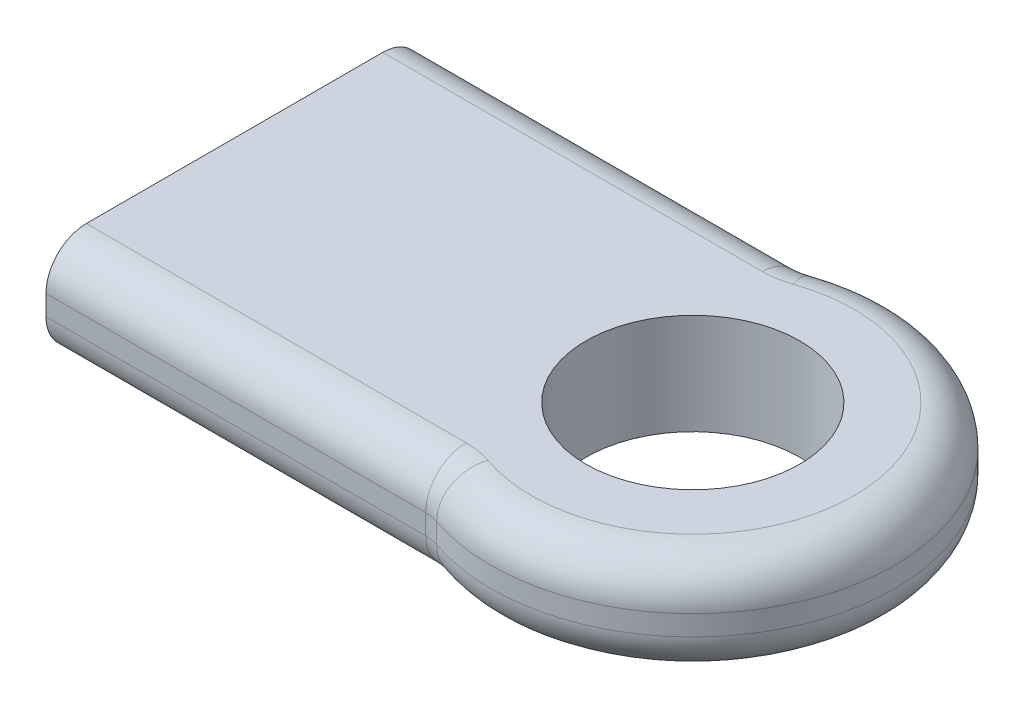
ISO-10303-21;
HEADER;
FILE_DESCRIPTION(('STEP AP214'),'2;1');
FILE_NAME('part.step','',(''),(''),'','','');
FILE_SCHEMA(('AUTOMOTIVE_DESIGN { 1 0 10303 214 1 1 1 1 }'));
ENDSEC;
DATA;
#1=APPLICATION_CONTEXT('core data for automotive mechanical design processes');
#2=APPLICATION_PROTOCOL_DEFINITION('international standard','automotive_design',2000,#1);
#3=PRODUCT_CONTEXT('',#1,'mechanical');
#4=PRODUCT('Part','Part','',(#3));
#5=PRODUCT_RELATED_PRODUCT_CATEGORY('part','',(#4));
#6=PRODUCT_DEFINITION_FORMATION('','',#4);
#7=PRODUCT_DEFINITION_CONTEXT('part definition',#1,'design');
#8=PRODUCT_DEFINITION('design','',#6,#7);
#9=PRODUCT_DEFINITION_SHAPE('','',#8);
#10=(LENGTH_UNIT() NAMED_UNIT(*) SI_UNIT(.MILLI.,.METRE.));
#11=(NAMED_UNIT(*) PLANE_ANGLE_UNIT() SI_UNIT($,.RADIAN.));
#12=(NAMED_UNIT(*) SI_UNIT($,.STERADIAN.) SOLID_ANGLE_UNIT());
#13=UNCERTAINTY_MEASURE_WITH_UNIT(LENGTH_MEASURE(1.E-05),#10,'distance_accuracy_value','');
#14=(GEOMETRIC_REPRESENTATION_CONTEXT(3) GLOBAL_UNCERTAINTY_ASSIGNED_CONTEXT((#13)) GLOBAL_UNIT_ASSIGNED_CONTEXT((#10,
#11,#12)) REPRESENTATION_CONTEXT('',''));
#15=CARTESIAN_POINT('',(0.,0.,0.));
#16=DIRECTION('',(0.,0.,1.));
#17=DIRECTION('',(1.,0.,0.));
#18=AXIS2_PLACEMENT_3D('',#15,#16,#17);
#19=CARTESIAN_POINT('',(0.,2.5,0.));
#20=DIRECTION('',(0.,1.,0.));
#21=DIRECTION('',(0.,0.,1.));
#22=AXIS2_PLACEMENT_3D('',#19,#20,#21);
#23=PLANE('',#22);
#24=DIRECTION('',(0.,0.,1.));
#25=VECTOR('',#24,1.);
#26=CARTESIAN_POINT('',(-22.72512135827,2.5,-9.35));
#27=LINE('',#26,#25);
#28=CARTESIAN_POINT('',(-22.72512135827,2.5,-7.35));
#29=VERTEX_POINT('',#28);
#30=CARTESIAN_POINT('',(-22.72512135827,2.5,7.35));
#31=VERTEX_POINT('',#30);
#32=EDGE_CURVE('E195',#29,#31,#27,.T.);
#33=ORIENTED_EDGE('',*,*,#32,.T.);
#34=DIRECTION('',(1.,0.,0.));
#35=VECTOR('',#34,1.);
#36=CARTESIAN_POINT('',(-3.54647712526107,2.5,7.35));
#37=LINE('',#36,#35);
#38=CARTESIAN_POINT('',(-3.8958311051687,2.5,7.35));
#39=VERTEX_POINT('',#38);
#40=EDGE_CURVE('E216',#31,#39,#37,.T.);
#41=ORIENTED_EDGE('',*,*,#40,.T.);
#42=CARTESIAN_POINT('',(-3.8958311051687,2.5,11.35));
#43=DIRECTION('',(0.,1.,0.));
#44=DIRECTION('',(0.,0.,1.));
#45=AXIS2_PLACEMENT_3D('',#42,#43,#44);
#46=CIRCLE('',#45,4.);
#47=CARTESIAN_POINT('',(-2.59722073677913,2.5,7.56666666666667));
#48=VERTEX_POINT('',#47);
#49=EDGE_CURVE('E213',#48,#39,#46,.T.);
#50=ORIENTED_EDGE('',*,*,#49,.F.);
#51=CARTESIAN_POINT('',(0.,2.5,0.));
#52=DIRECTION('',(0.,1.,0.));
#53=DIRECTION('',(0.,0.,1.));
#54=AXIS2_PLACEMENT_3D('',#51,#52,#53);
#55=CIRCLE('',#54,8.);
#56=CARTESIAN_POINT('',(-2.59722073677913,2.5,-7.56666666666667));
#57=VERTEX_POINT('',#56);
#58=EDGE_CURVE('E209',#48,#57,#55,.T.);
#59=ORIENTED_EDGE('',*,*,#58,.T.);
#60=CARTESIAN_POINT('',(-3.8958311051687,2.5,-11.35));
#61=DIRECTION('',(0.,1.,0.));
#62=DIRECTION('',(0.,0.,1.));
#63=AXIS2_PLACEMENT_3D('',#60,#61,#62);
#64=CIRCLE('',#63,4.);
#65=CARTESIAN_POINT('',(-3.8958311051687,2.5,-7.35));
#66=VERTEX_POINT('',#65);
#67=EDGE_CURVE('E206',#66,#57,#64,.T.);
#68=ORIENTED_EDGE('',*,*,#67,.F.);
#69=DIRECTION('',(-1.,0.,0.));
#70=VECTOR('',#69,1.);
#71=CARTESIAN_POINT('',(-22.72512135827,2.5,-7.35));
#72=LINE('',#71,#70);
#73=EDGE_CURVE('E211',#66,#29,#72,.T.);
#74=ORIENTED_EDGE('',*,*,#73,.T.);
#75=EDGE_LOOP('',(#33,#41,#50,#59,#68,#74));
#76=FACE_BOUND('',#75,.T.);
#77=CARTESIAN_POINT('',(0.,2.5,0.));
#78=DIRECTION('',(0.,1.,0.));
#79=DIRECTION('',(0.,0.,1.));
#80=AXIS2_PLACEMENT_3D('',#77,#78,#79);
#81=CIRCLE('',#80,5.3);
#82=CARTESIAN_POINT('',(0.,2.5,5.3));
#83=VERTEX_POINT('',#82);
#84=EDGE_CURVE('E189',#83,#83,#81,.T.);
#85=ORIENTED_EDGE('',*,*,#84,.F.);
#86=EDGE_LOOP('',(#85));
#87=FACE_BOUND('',#86,.T.);
#88=ADVANCED_FACE('F33',(#76,#87),#23,.T.);
#89=CARTESIAN_POINT('',(0.,-2.5,0.));
#90=DIRECTION('',(0.,1.,0.));
#91=DIRECTION('',(0.,0.,1.));
#92=AXIS2_PLACEMENT_3D('',#89,#90,#91);
#93=PLANE('',#92);
#94=CARTESIAN_POINT('',(-3.8958311051687,-2.5,11.35));
#95=DIRECTION('',(0.,1.,0.));
#96=DIRECTION('',(0.,0.,1.));
#97=AXIS2_PLACEMENT_3D('',#94,#95,#96);
#98=CIRCLE('',#97,4.);
#99=CARTESIAN_POINT('',(-3.8958311051687,-2.5,7.35));
#100=VERTEX_POINT('',#99);
#101=CARTESIAN_POINT('',(-2.59722073677913,-2.5,7.56666666666667));
#102=VERTEX_POINT('',#101);
#103=EDGE_CURVE('E233',#100,#102,#98,.F.);
#104=ORIENTED_EDGE('',*,*,#103,.F.);
#105=DIRECTION('',(1.,0.,0.));
#106=VECTOR('',#105,1.);
#107=CARTESIAN_POINT('',(0.,-2.5,7.35));
#108=LINE('',#107,#106);
#109=CARTESIAN_POINT('',(-22.72512135827,-2.5,7.35));
#110=VERTEX_POINT('',#109);
#111=EDGE_CURVE('E243',#100,#110,#108,.F.);
#112=ORIENTED_EDGE('',*,*,#111,.T.);
#113=DIRECTION('',(0.,0.,1.));
#114=VECTOR('',#113,1.);
#115=CARTESIAN_POINT('',(-22.72512135827,-2.5,-9.35));
#116=LINE('',#115,#114);
#117=CARTESIAN_POINT('',(-22.72512135827,-2.5,-7.35));
#118=VERTEX_POINT('',#117);
#119=EDGE_CURVE('E192',#118,#110,#116,.T.);
#120=ORIENTED_EDGE('',*,*,#119,.F.);
#121=DIRECTION('',(-1.,0.,0.));
#122=VECTOR('',#121,1.);
#123=CARTESIAN_POINT('',(0.,-2.5,-7.35));
#124=LINE('',#123,#122);
#125=CARTESIAN_POINT('',(-3.8958311051687,-2.5,-7.35));
#126=VERTEX_POINT('',#125);
#127=EDGE_CURVE('E241',#118,#126,#124,.F.);
#128=ORIENTED_EDGE('',*,*,#127,.T.);
#129=CARTESIAN_POINT('',(-3.8958311051687,-2.5,-11.35));
#130=DIRECTION('',(0.,1.,0.));
#131=DIRECTION('',(0.,0.,1.));
#132=AXIS2_PLACEMENT_3D('',#129,#130,#131);
#133=CIRCLE('',#132,4.);
#134=CARTESIAN_POINT('',(-2.59722073677913,-2.5,-7.56666666666667));
#135=VERTEX_POINT('',#134);
#136=EDGE_CURVE('E238',#135,#126,#133,.F.);
#137=ORIENTED_EDGE('',*,*,#136,.F.);
#138=CARTESIAN_POINT('',(0.,-2.5,0.));
#139=DIRECTION('',(0.,1.,0.));
#140=DIRECTION('',(0.,0.,1.));
#141=AXIS2_PLACEMENT_3D('',#138,#139,#140);
#142=CIRCLE('',#141,8.);
#143=EDGE_CURVE('E236',#135,#102,#142,.F.);
#144=ORIENTED_EDGE('',*,*,#143,.T.);
#145=EDGE_LOOP('',(#104,#112,#120,#128,#137,#144));
#146=FACE_BOUND('',#145,.T.);
#147=CARTESIAN_POINT('',(0.,-2.5,0.));
#148=DIRECTION('',(0.,1.,0.));
#149=DIRECTION('',(0.,0.,1.));
#150=AXIS2_PLACEMENT_3D('',#147,#148,#149);
#151=CIRCLE('',#150,5.3);
#152=CARTESIAN_POINT('',(0.,-2.5,5.3));
#153=VERTEX_POINT('',#152);
#154=EDGE_CURVE('E185',#153,#153,#151,.T.);
#155=ORIENTED_EDGE('',*,*,#154,.T.);
#156=EDGE_LOOP('',(#155));
#157=FACE_BOUND('',#156,.T.);
#158=ADVANCED_FACE('F357',(#146,#157),#93,.F.);
#159=CARTESIAN_POINT('',(-22.72512135827,2.5,-9.35));
#160=DIRECTION('',(1.,0.,0.));
#161=DIRECTION('',(0.,0.,-1.));
#162=AXIS2_PLACEMENT_3D('',#159,#160,#161);
#163=PLANE('',#162);
#164=DIRECTION('',(0.,0.,1.));
#165=VECTOR('',#164,1.);
#166=CARTESIAN_POINT('',(-22.72512135827,-1.,-6.55));
#167=LINE('',#166,#165);
#168=CARTESIAN_POINT('',(-22.72512135827,-1.,-6.55));
#169=VERTEX_POINT('',#168);
#170=CARTESIAN_POINT('',(-22.72512135827,-1.,6.55));
#171=VERTEX_POINT('',#170);
#172=EDGE_CURVE('E179',#169,#171,#167,.T.);
#173=ORIENTED_EDGE('',*,*,#172,.F.);
#174=DIRECTION('',(0.,-1.,0.));
#175=VECTOR('',#174,1.);
#176=CARTESIAN_POINT('',(-22.72512135827,1.,-6.55));
#177=LINE('',#176,#175);
#178=CARTESIAN_POINT('',(-22.72512135827,1.,-6.55));
#179=VERTEX_POINT('',#178);
#180=EDGE_CURVE('E153',#179,#169,#177,.T.);
#181=ORIENTED_EDGE('',*,*,#180,.F.);
#182=DIRECTION('',(0.,0.,-1.));
#183=VECTOR('',#182,1.);
#184=CARTESIAN_POINT('',(-22.72512135827,1.,-6.55));
#185=LINE('',#184,#183);
#186=CARTESIAN_POINT('',(-22.72512135827,1.,6.55));
#187=VERTEX_POINT('',#186);
#188=EDGE_CURVE('E170',#187,#179,#185,.T.);
#189=ORIENTED_EDGE('',*,*,#188,.F.);
#190=DIRECTION('',(0.,1.,0.));
#191=VECTOR('',#190,1.);
#192=CARTESIAN_POINT('',(-22.72512135827,1.,6.55));
#193=LINE('',#192,#191);
#194=EDGE_CURVE('E173',#171,#187,#193,.T.);
#195=ORIENTED_EDGE('',*,*,#194,.F.);
#196=EDGE_LOOP('',(#173,#181,#189,#195));
#197=FACE_BOUND('',#196,.T.);
#198=DIRECTION('',(0.,-1.,0.));
#199=VECTOR('',#198,1.);
#200=CARTESIAN_POINT('',(-22.72512135827,2.5,9.35));
#201=LINE('',#200,#199);
#202=CARTESIAN_POINT('',(-22.72512135827,0.5,9.35));
#203=VERTEX_POINT('',#202);
#204=CARTESIAN_POINT('',(-22.72512135827,-0.5,9.35));
#205=VERTEX_POINT('',#204);
#206=EDGE_CURVE('E203',#203,#205,#201,.T.);
#207=ORIENTED_EDGE('',*,*,#206,.F.);
#208=CARTESIAN_POINT('',(-22.72512135827,0.5,7.35));
#209=DIRECTION('',(1.,0.,0.));
#210=DIRECTION('',(0.,0.,-1.));
#211=AXIS2_PLACEMENT_3D('',#208,#209,#210);
#212=CIRCLE('',#211,2.);
#213=EDGE_CURVE('E231',#203,#31,#212,.F.);
#214=ORIENTED_EDGE('',*,*,#213,.T.);
#215=ORIENTED_EDGE('',*,*,#32,.F.);
#216=CARTESIAN_POINT('',(-22.72512135827,0.5,-7.35));
#217=DIRECTION('',(1.,0.,0.));
#218=DIRECTION('',(0.,0.,-1.));
#219=AXIS2_PLACEMENT_3D('',#216,#217,#218);
#220=CIRCLE('',#219,2.);
#221=CARTESIAN_POINT('',(-22.72512135827,0.5,-9.35));
#222=VERTEX_POINT('',#221);
#223=EDGE_CURVE('E227',#29,#222,#220,.F.);
#224=ORIENTED_EDGE('',*,*,#223,.T.);
#225=DIRECTION('',(0.,-1.,0.));
#226=VECTOR('',#225,1.);
#227=CARTESIAN_POINT('',(-22.72512135827,2.5,-9.35));
#228=LINE('',#227,#226);
#229=CARTESIAN_POINT('',(-22.72512135827,-0.5,-9.35));
#230=VERTEX_POINT('',#229);
#231=EDGE_CURVE('E198',#222,#230,#228,.T.);
#232=ORIENTED_EDGE('',*,*,#231,.T.);
#233=CARTESIAN_POINT('',(-22.72512135827,-0.5,-7.35));
#234=DIRECTION('',(1.,0.,0.));
#235=DIRECTION('',(0.,0.,-1.));
#236=AXIS2_PLACEMENT_3D('',#233,#234,#235);
#237=CIRCLE('',#236,2.);
#238=EDGE_CURVE('E225',#230,#118,#237,.F.);
#239=ORIENTED_EDGE('',*,*,#238,.T.);
#240=ORIENTED_EDGE('',*,*,#119,.T.);
#241=CARTESIAN_POINT('',(-22.72512135827,-0.5,7.35));
#242=DIRECTION('',(1.,0.,0.));
#243=DIRECTION('',(0.,0.,-1.));
#244=AXIS2_PLACEMENT_3D('',#241,#242,#243);
#245=CIRCLE('',#244,2.);
#246=EDGE_CURVE('E229',#110,#205,#245,.F.);
#247=ORIENTED_EDGE('',*,*,#246,.T.);
#248=EDGE_LOOP('',(#207,#214,#215,#224,#232,#239,#240,#247));
#249=FACE_BOUND('',#248,.T.);
#250=ADVANCED_FACE('F302',(#197,#249),#163,.F.);
#251=CARTESIAN_POINT('',(-22.72512135827,2.5,9.35));
#252=DIRECTION('',(0.,0.,-1.));
#253=DIRECTION('',(-1.,0.,0.));
#254=AXIS2_PLACEMENT_3D('',#251,#252,#253);
#255=PLANE('',#254);
#256=DIRECTION('',(0.,1.,0.));
#257=VECTOR('',#256,1.);
#258=CARTESIAN_POINT('',(-3.8958311051687,2.5,9.35));
#259=LINE('',#258,#257);
#260=CARTESIAN_POINT('',(-3.8958311051687,-0.5,9.35));
#261=VERTEX_POINT('',#260);
#262=CARTESIAN_POINT('',(-3.8958311051687,0.5,9.35));
#263=VERTEX_POINT('',#262);
#264=EDGE_CURVE('E219',#261,#263,#259,.T.);
#265=ORIENTED_EDGE('',*,*,#264,.T.);
#266=DIRECTION('',(1.,0.,0.));
#267=VECTOR('',#266,1.);
#268=CARTESIAN_POINT('',(-22.72512135827,0.5,9.35));
#269=LINE('',#268,#267);
#270=EDGE_CURVE('E223',#263,#203,#269,.F.);
#271=ORIENTED_EDGE('',*,*,#270,.T.);
#272=ORIENTED_EDGE('',*,*,#206,.T.);
#273=DIRECTION('',(1.,0.,0.));
#274=VECTOR('',#273,1.);
#275=CARTESIAN_POINT('',(-22.72512135827,-0.5,9.35));
#276=LINE('',#275,#274);
#277=EDGE_CURVE('E221',#205,#261,#276,.T.);
#278=ORIENTED_EDGE('',*,*,#277,.T.);
#279=EDGE_LOOP('',(#265,#271,#272,#278));
#280=FACE_BOUND('',#279,.T.);
#281=ADVANCED_FACE('F331',(#280),#255,.F.);
#282=CARTESIAN_POINT('',(0.,2.5,0.));
#283=DIRECTION('',(0.,-1.,0.));
#284=DIRECTION('',(0.,0.,-1.));
#285=AXIS2_PLACEMENT_3D('',#282,#283,#284);
#286=CYLINDRICAL_SURFACE('',#285,10.);
#287=CARTESIAN_POINT('',(0.,0.5,0.));
#288=DIRECTION('',(0.,1.,0.));
#289=DIRECTION('',(0.,0.,1.));
#290=AXIS2_PLACEMENT_3D('',#287,#288,#289);
#291=CIRCLE('',#290,10.);
#292=CARTESIAN_POINT('',(-3.24652592097392,0.5,-9.45833333333333));
#293=VERTEX_POINT('',#292);
#294=CARTESIAN_POINT('',(-3.24652592097392,0.5,9.45833333333333));
#295=VERTEX_POINT('',#294);
#296=EDGE_CURVE('E42',#293,#295,#291,.F.);
#297=ORIENTED_EDGE('',*,*,#296,.T.);
#298=DIRECTION('',(0.,-1.,0.));
#299=VECTOR('',#298,1.);
#300=CARTESIAN_POINT('',(-3.24652592097392,2.5,9.45833333333333));
#301=LINE('',#300,#299);
#302=CARTESIAN_POINT('',(-3.24652592097392,-0.5,9.45833333333333));
#303=VERTEX_POINT('',#302);
#304=EDGE_CURVE('E11',#295,#303,#301,.T.);
#305=ORIENTED_EDGE('',*,*,#304,.T.);
#306=CARTESIAN_POINT('',(0.,-0.5,0.));
#307=DIRECTION('',(0.,1.,0.));
#308=DIRECTION('',(0.,0.,1.));
#309=AXIS2_PLACEMENT_3D('',#306,#307,#308);
#310=CIRCLE('',#309,10.);
#311=CARTESIAN_POINT('',(-3.24652592097392,-0.5,-9.45833333333333));
#312=VERTEX_POINT('',#311);
#313=EDGE_CURVE('E251',#303,#312,#310,.T.);
#314=ORIENTED_EDGE('',*,*,#313,.T.);
#315=DIRECTION('',(0.,-1.,0.));
#316=VECTOR('',#315,1.);
#317=CARTESIAN_POINT('',(-3.24652592097392,2.5,-9.45833333333333));
#318=LINE('',#317,#316);
#319=EDGE_CURVE('E53',#312,#293,#318,.F.);
#320=ORIENTED_EDGE('',*,*,#319,.T.);
#321=EDGE_LOOP('',(#297,#305,#314,#320));
#322=FACE_BOUND('',#321,.T.);
#323=ADVANCED_FACE('F346',(#322),#286,.T.);
#324=CARTESIAN_POINT('',(-22.72512135827,2.5,-9.35));
#325=DIRECTION('',(0.,0.,1.));
#326=DIRECTION('',(1.,0.,0.));
#327=AXIS2_PLACEMENT_3D('',#324,#325,#326);
#328=PLANE('',#327);
#329=ORIENTED_EDGE('',*,*,#231,.F.);
#330=DIRECTION('',(-1.,0.,0.));
#331=VECTOR('',#330,1.);
#332=CARTESIAN_POINT('',(-3.54647712526106,0.5,-9.35));
#333=LINE('',#332,#331);
#334=CARTESIAN_POINT('',(-3.8958311051687,0.5,-9.35));
#335=VERTEX_POINT('',#334);
#336=EDGE_CURVE('E249',#222,#335,#333,.F.);
#337=ORIENTED_EDGE('',*,*,#336,.T.);
#338=DIRECTION('',(0.,1.,0.));
#339=VECTOR('',#338,1.);
#340=CARTESIAN_POINT('',(-3.8958311051687,-2.5,-9.35));
#341=LINE('',#340,#339);
#342=CARTESIAN_POINT('',(-3.8958311051687,-0.5,-9.35));
#343=VERTEX_POINT('',#342);
#344=EDGE_CURVE('E245',#335,#343,#341,.F.);
#345=ORIENTED_EDGE('',*,*,#344,.T.);
#346=DIRECTION('',(-1.,0.,0.));
#347=VECTOR('',#346,1.);
#348=CARTESIAN_POINT('',(-22.72512135827,-0.5,-9.35));
#349=LINE('',#348,#347);
#350=EDGE_CURVE('E247',#343,#230,#349,.T.);
#351=ORIENTED_EDGE('',*,*,#350,.T.);
#352=EDGE_LOOP('',(#329,#337,#345,#351));
#353=FACE_BOUND('',#352,.T.);
#354=ADVANCED_FACE('F298',(#353),#328,.F.);
#355=CARTESIAN_POINT('',(0.,2.5,0.));
#356=DIRECTION('',(0.,-1.,0.));
#357=DIRECTION('',(0.,0.,-1.));
#358=AXIS2_PLACEMENT_3D('',#355,#356,#357);
#359=CYLINDRICAL_SURFACE('',#358,5.3);
#360=ORIENTED_EDGE('',*,*,#84,.T.);
#361=EDGE_LOOP('',(#360));
#362=FACE_BOUND('',#361,.T.);
#363=ORIENTED_EDGE('',*,*,#154,.F.);
#364=EDGE_LOOP('',(#363));
#365=FACE_BOUND('',#364,.T.);
#366=ADVANCED_FACE('F353',(#362,#365),#359,.F.);
#367=CARTESIAN_POINT('',(-7.72512135827004,1.,-6.55));
#368=DIRECTION('',(0.,0.,-1.));
#369=DIRECTION('',(-1.,0.,0.));
#370=AXIS2_PLACEMENT_3D('',#367,#368,#369);
#371=PLANE('',#370);
#372=ORIENTED_EDGE('',*,*,#180,.T.);
#373=DIRECTION('',(-1.,0.,0.));
#374=VECTOR('',#373,1.);
#375=CARTESIAN_POINT('',(-7.72512135827004,-1.,-6.55));
#376=LINE('',#375,#374);
#377=CARTESIAN_POINT('',(-7.72512135827004,-1.,-6.55));
#378=VERTEX_POINT('',#377);
#379=EDGE_CURVE('E146',#378,#169,#376,.T.);
#380=ORIENTED_EDGE('',*,*,#379,.F.);
#381=DIRECTION('',(0.,-1.,0.));
#382=VECTOR('',#381,1.);
#383=CARTESIAN_POINT('',(-7.72512135827004,1.,-6.55));
#384=LINE('',#383,#382);
#385=CARTESIAN_POINT('',(-7.72512135827004,1.,-6.55));
#386=VERTEX_POINT('',#385);
#387=EDGE_CURVE('E150',#386,#378,#384,.T.);
#388=ORIENTED_EDGE('',*,*,#387,.F.);
#389=DIRECTION('',(-1.,0.,0.));
#390=VECTOR('',#389,1.);
#391=CARTESIAN_POINT('',(-7.72512135827004,1.,-6.55));
#392=LINE('',#391,#390);
#393=EDGE_CURVE('E183',#386,#179,#392,.T.);
#394=ORIENTED_EDGE('',*,*,#393,.T.);
#395=EDGE_LOOP('',(#372,#380,#388,#394));
#396=FACE_BOUND('',#395,.T.);
#397=ADVANCED_FACE('F148',(#396),#371,.F.);
#398=CARTESIAN_POINT('',(-7.72512135827004,1.,-6.55));
#399=DIRECTION('',(0.,1.,0.));
#400=DIRECTION('',(0.,0.,1.));
#401=AXIS2_PLACEMENT_3D('',#398,#399,#400);
#402=PLANE('',#401);
#403=ORIENTED_EDGE('',*,*,#188,.T.);
#404=ORIENTED_EDGE('',*,*,#393,.F.);
#405=DIRECTION('',(0.,0.,-1.));
#406=VECTOR('',#405,1.);
#407=CARTESIAN_POINT('',(-7.72512135827004,1.,-6.55));
#408=LINE('',#407,#406);
#409=CARTESIAN_POINT('',(-7.72512135827004,1.,6.55));
#410=VERTEX_POINT('',#409);
#411=EDGE_CURVE('E158',#410,#386,#408,.T.);
#412=ORIENTED_EDGE('',*,*,#411,.F.);
#413=DIRECTION('',(-1.,0.,0.));
#414=VECTOR('',#413,1.);
#415=CARTESIAN_POINT('',(-7.72512135827004,1.,6.55));
#416=LINE('',#415,#414);
#417=EDGE_CURVE('E186',#410,#187,#416,.T.);
#418=ORIENTED_EDGE('',*,*,#417,.T.);
#419=EDGE_LOOP('',(#403,#404,#412,#418));
#420=FACE_BOUND('',#419,.T.);
#421=ADVANCED_FACE('F372',(#420),#402,.F.);
#422=CARTESIAN_POINT('',(-7.72512135827004,1.,6.55));
#423=DIRECTION('',(0.,0.,1.));
#424=DIRECTION('',(0.,-1.,0.));
#425=AXIS2_PLACEMENT_3D('',#422,#423,#424);
#426=PLANE('',#425);
#427=ORIENTED_EDGE('',*,*,#194,.T.);
#428=ORIENTED_EDGE('',*,*,#417,.F.);
#429=DIRECTION('',(0.,1.,0.));
#430=VECTOR('',#429,1.);
#431=CARTESIAN_POINT('',(-7.72512135827004,1.,6.55));
#432=LINE('',#431,#430);
#433=CARTESIAN_POINT('',(-7.72512135827004,-1.,6.55));
#434=VERTEX_POINT('',#433);
#435=EDGE_CURVE('E166',#434,#410,#432,.T.);
#436=ORIENTED_EDGE('',*,*,#435,.F.);
#437=DIRECTION('',(-1.,0.,0.));
#438=VECTOR('',#437,1.);
#439=CARTESIAN_POINT('',(-7.72512135827004,-1.,6.55));
#440=LINE('',#439,#438);
#441=EDGE_CURVE('E157',#434,#171,#440,.T.);
#442=ORIENTED_EDGE('',*,*,#441,.T.);
#443=EDGE_LOOP('',(#427,#428,#436,#442));
#444=FACE_BOUND('',#443,.T.);
#445=ADVANCED_FACE('F375',(#444),#426,.F.);
#446=CARTESIAN_POINT('',(-7.72512135827004,-1.,-6.55));
#447=DIRECTION('',(0.,-1.,0.));
#448=DIRECTION('',(0.,0.,-1.));
#449=AXIS2_PLACEMENT_3D('',#446,#447,#448);
#450=PLANE('',#449);
#451=ORIENTED_EDGE('',*,*,#172,.T.);
#452=ORIENTED_EDGE('',*,*,#441,.F.);
#453=DIRECTION('',(0.,0.,1.));
#454=VECTOR('',#453,1.);
#455=CARTESIAN_POINT('',(-7.72512135827004,-1.,-6.55));
#456=LINE('',#455,#454);
#457=EDGE_CURVE('E161',#378,#434,#456,.T.);
#458=ORIENTED_EDGE('',*,*,#457,.F.);
#459=ORIENTED_EDGE('',*,*,#379,.T.);
#460=EDGE_LOOP('',(#451,#452,#458,#459));
#461=FACE_BOUND('',#460,.T.);
#462=ADVANCED_FACE('F162',(#461),#450,.F.);
#463=CARTESIAN_POINT('',(-7.72512135827004,0.,0.));
#464=DIRECTION('',(-1.,0.,0.));
#465=DIRECTION('',(0.,0.,1.));
#466=AXIS2_PLACEMENT_3D('',#463,#464,#465);
#467=PLANE('',#466);
#468=ORIENTED_EDGE('',*,*,#387,.T.);
#469=ORIENTED_EDGE('',*,*,#457,.T.);
#470=ORIENTED_EDGE('',*,*,#435,.T.);
#471=ORIENTED_EDGE('',*,*,#411,.T.);
#472=EDGE_LOOP('',(#468,#469,#470,#471));
#473=FACE_BOUND('',#472,.T.);
#474=ADVANCED_FACE('F168',(#473),#467,.T.);
#475=CARTESIAN_POINT('',(-22.72512135827,-0.5,-7.35));
#476=DIRECTION('',(-1.,0.,0.));
#477=DIRECTION('',(0.,0.,1.));
#478=AXIS2_PLACEMENT_3D('',#475,#476,#477);
#479=CYLINDRICAL_SURFACE('',#478,2.);
#480=CARTESIAN_POINT('',(-3.8958311051687,-0.5,-7.35));
#481=DIRECTION('',(1.,0.,0.));
#482=DIRECTION('',(0.,0.,-1.));
#483=AXIS2_PLACEMENT_3D('',#480,#481,#482);
#484=CIRCLE('',#483,2.);
#485=EDGE_CURVE('E37',#126,#343,#484,.T.);
#486=ORIENTED_EDGE('',*,*,#485,.F.);
#487=ORIENTED_EDGE('',*,*,#127,.F.);
#488=ORIENTED_EDGE('',*,*,#238,.F.);
#489=ORIENTED_EDGE('',*,*,#350,.F.);
#490=EDGE_LOOP('',(#486,#487,#488,#489));
#491=FACE_BOUND('',#490,.T.);
#492=ADVANCED_FACE('F35',(#491),#479,.T.);
#493=CARTESIAN_POINT('',(-3.8958311051687,-0.5,-11.35));
#494=DIRECTION('',(0.,1.,0.));
#495=DIRECTION('',(0.,0.,1.));
#496=AXIS2_PLACEMENT_3D('',#493,#494,#495);
#497=TOROIDAL_SURFACE('',#496,4.,2.);
#498=ORIENTED_EDGE('',*,*,#136,.T.);
#499=ORIENTED_EDGE('',*,*,#485,.T.);
#500=CARTESIAN_POINT('',(-3.8958311051687,-0.5,-11.35));
#501=DIRECTION('',(0.,1.,0.));
#502=DIRECTION('',(0.,0.,1.));
#503=AXIS2_PLACEMENT_3D('',#500,#501,#502);
#504=CIRCLE('',#503,2.);
#505=EDGE_CURVE('E282',#312,#343,#504,.F.);
#506=ORIENTED_EDGE('',*,*,#505,.F.);
#507=CARTESIAN_POINT('',(-2.59722073677913,-0.5,-7.56666666666667));
#508=DIRECTION('',(-0.945833333333333,0.,0.324652592097392));
#509=DIRECTION('',(0.324652592097392,0.,0.945833333333334));
#510=AXIS2_PLACEMENT_3D('',#507,#508,#509);
#511=CIRCLE('',#510,2.);
#512=EDGE_CURVE('E280',#135,#312,#511,.F.);
#513=ORIENTED_EDGE('',*,*,#512,.F.);
#514=EDGE_LOOP('',(#498,#499,#506,#513));
#515=FACE_BOUND('',#514,.T.);
#516=ADVANCED_FACE('F290',(#515),#497,.T.);
#517=CARTESIAN_POINT('',(0.,0.5,-7.35));
#518=DIRECTION('',(1.,0.,0.));
#519=DIRECTION('',(0.,0.,-1.));
#520=AXIS2_PLACEMENT_3D('',#517,#518,#519);
#521=CYLINDRICAL_SURFACE('',#520,2.);
#522=ORIENTED_EDGE('',*,*,#223,.F.);
#523=ORIENTED_EDGE('',*,*,#73,.F.);
#524=CARTESIAN_POINT('',(-3.8958311051687,0.5,-7.35));
#525=DIRECTION('',(1.,0.,0.));
#526=DIRECTION('',(0.,0.,-1.));
#527=AXIS2_PLACEMENT_3D('',#524,#525,#526);
#528=CIRCLE('',#527,2.);
#529=EDGE_CURVE('E277',#335,#66,#528,.T.);
#530=ORIENTED_EDGE('',*,*,#529,.F.);
#531=ORIENTED_EDGE('',*,*,#336,.F.);
#532=EDGE_LOOP('',(#522,#523,#530,#531));
#533=FACE_BOUND('',#532,.T.);
#534=ADVANCED_FACE('F308',(#533),#521,.T.);
#535=CARTESIAN_POINT('',(-3.8958311051687,2.5,-11.35));
#536=DIRECTION('',(0.,-1.,0.));
#537=DIRECTION('',(0.,0.,-1.));
#538=AXIS2_PLACEMENT_3D('',#535,#536,#537);
#539=CYLINDRICAL_SURFACE('',#538,2.);
#540=ORIENTED_EDGE('',*,*,#505,.T.);
#541=ORIENTED_EDGE('',*,*,#344,.F.);
#542=CARTESIAN_POINT('',(-3.8958311051687,0.5,-11.35));
#543=DIRECTION('',(0.,1.,0.));
#544=DIRECTION('',(0.,0.,1.));
#545=AXIS2_PLACEMENT_3D('',#542,#543,#544);
#546=CIRCLE('',#545,2.);
#547=EDGE_CURVE('E274',#293,#335,#546,.F.);
#548=ORIENTED_EDGE('',*,*,#547,.F.);
#549=ORIENTED_EDGE('',*,*,#319,.F.);
#550=EDGE_LOOP('',(#540,#541,#548,#549));
#551=FACE_BOUND('',#550,.T.);
#552=ADVANCED_FACE('F310',(#551),#539,.F.);
#553=CARTESIAN_POINT('',(0.,-0.5,0.));
#554=DIRECTION('',(0.,1.,0.));
#555=DIRECTION('',(0.,0.,1.));
#556=AXIS2_PLACEMENT_3D('',#553,#554,#555);
#557=TOROIDAL_SURFACE('',#556,8.,2.);
#558=ORIENTED_EDGE('',*,*,#512,.T.);
#559=ORIENTED_EDGE('',*,*,#313,.F.);
#560=CARTESIAN_POINT('',(-2.59722073677913,-0.5,7.56666666666667));
#561=DIRECTION('',(-0.945833333333333,0.,-0.324652592097392));
#562=DIRECTION('',(-0.324652592097392,0.,0.945833333333334));
#563=AXIS2_PLACEMENT_3D('',#560,#561,#562);
#564=CIRCLE('',#563,2.);
#565=EDGE_CURVE('E271',#102,#303,#564,.T.);
#566=ORIENTED_EDGE('',*,*,#565,.F.);
#567=ORIENTED_EDGE('',*,*,#143,.F.);
#568=EDGE_LOOP('',(#558,#559,#566,#567));
#569=FACE_BOUND('',#568,.T.);
#570=ADVANCED_FACE('F345',(#569),#557,.T.);
#571=CARTESIAN_POINT('',(-22.72512135827,-0.5,7.35));
#572=DIRECTION('',(1.,0.,0.));
#573=DIRECTION('',(0.,0.,-1.));
#574=AXIS2_PLACEMENT_3D('',#571,#572,#573);
#575=CYLINDRICAL_SURFACE('',#574,2.);
#576=ORIENTED_EDGE('',*,*,#246,.F.);
#577=ORIENTED_EDGE('',*,*,#111,.F.);
#578=CARTESIAN_POINT('',(-3.8958311051687,-0.5,7.35));
#579=DIRECTION('',(1.,0.,0.));
#580=DIRECTION('',(0.,0.,-1.));
#581=AXIS2_PLACEMENT_3D('',#578,#579,#580);
#582=CIRCLE('',#581,2.);
#583=EDGE_CURVE('E268',#261,#100,#582,.T.);
#584=ORIENTED_EDGE('',*,*,#583,.F.);
#585=ORIENTED_EDGE('',*,*,#277,.F.);
#586=EDGE_LOOP('',(#576,#577,#584,#585));
#587=FACE_BOUND('',#586,.T.);
#588=ADVANCED_FACE('F336',(#587),#575,.T.);
#589=CARTESIAN_POINT('',(-3.8958311051687,0.5,-11.35));
#590=DIRECTION('',(0.,1.,0.));
#591=DIRECTION('',(0.,0.,1.));
#592=AXIS2_PLACEMENT_3D('',#589,#590,#591);
#593=TOROIDAL_SURFACE('',#592,4.,2.);
#594=ORIENTED_EDGE('',*,*,#529,.T.);
#595=ORIENTED_EDGE('',*,*,#67,.T.);
#596=CARTESIAN_POINT('',(-2.59722073677913,0.5,-7.56666666666667));
#597=DIRECTION('',(-0.945833333333333,0.,0.324652592097392));
#598=DIRECTION('',(0.324652592097392,0.,0.945833333333334));
#599=AXIS2_PLACEMENT_3D('',#596,#597,#598);
#600=CIRCLE('',#599,2.);
#601=EDGE_CURVE('E265',#293,#57,#600,.F.);
#602=ORIENTED_EDGE('',*,*,#601,.F.);
#603=ORIENTED_EDGE('',*,*,#547,.T.);
#604=EDGE_LOOP('',(#594,#595,#602,#603));
#605=FACE_BOUND('',#604,.T.);
#606=ADVANCED_FACE('F313',(#605),#593,.T.);
#607=CARTESIAN_POINT('',(-3.8958311051687,-0.5,11.35));
#608=DIRECTION('',(0.,1.,0.));
#609=DIRECTION('',(0.,0.,1.));
#610=AXIS2_PLACEMENT_3D('',#607,#608,#609);
#611=TOROIDAL_SURFACE('',#610,4.,2.);
#612=ORIENTED_EDGE('',*,*,#103,.T.);
#613=ORIENTED_EDGE('',*,*,#565,.T.);
#614=CARTESIAN_POINT('',(-3.8958311051687,-0.5,11.35));
#615=DIRECTION('',(0.,1.,0.));
#616=DIRECTION('',(0.,0.,1.));
#617=AXIS2_PLACEMENT_3D('',#614,#615,#616);
#618=CIRCLE('',#617,2.);
#619=EDGE_CURVE('E263',#261,#303,#618,.F.);
#620=ORIENTED_EDGE('',*,*,#619,.F.);
#621=ORIENTED_EDGE('',*,*,#583,.T.);
#622=EDGE_LOOP('',(#612,#613,#620,#621));
#623=FACE_BOUND('',#622,.T.);
#624=ADVANCED_FACE('F340',(#623),#611,.T.);
#625=CARTESIAN_POINT('',(0.,0.5,0.));
#626=DIRECTION('',(0.,1.,0.));
#627=DIRECTION('',(0.,0.,1.));
#628=AXIS2_PLACEMENT_3D('',#625,#626,#627);
#629=TOROIDAL_SURFACE('',#628,8.,2.);
#630=ORIENTED_EDGE('',*,*,#601,.T.);
#631=ORIENTED_EDGE('',*,*,#58,.F.);
#632=CARTESIAN_POINT('',(-2.59722073677913,0.5,7.56666666666667));
#633=DIRECTION('',(-0.945833333333333,0.,-0.324652592097392));
#634=DIRECTION('',(-0.324652592097392,0.,0.945833333333334));
#635=AXIS2_PLACEMENT_3D('',#632,#633,#634);
#636=CIRCLE('',#635,2.);
#637=EDGE_CURVE('E260',#295,#48,#636,.T.);
#638=ORIENTED_EDGE('',*,*,#637,.F.);
#639=ORIENTED_EDGE('',*,*,#296,.F.);
#640=EDGE_LOOP('',(#630,#631,#638,#639));
#641=FACE_BOUND('',#640,.T.);
#642=ADVANCED_FACE('F317',(#641),#629,.T.);
#643=CARTESIAN_POINT('',(-3.8958311051687,2.5,11.35));
#644=DIRECTION('',(0.,-1.,0.));
#645=DIRECTION('',(0.,0.,-1.));
#646=AXIS2_PLACEMENT_3D('',#643,#644,#645);
#647=CYLINDRICAL_SURFACE('',#646,2.);
#648=ORIENTED_EDGE('',*,*,#619,.T.);
#649=ORIENTED_EDGE('',*,*,#304,.F.);
#650=CARTESIAN_POINT('',(-3.8958311051687,0.5,11.35));
#651=DIRECTION('',(0.,1.,0.));
#652=DIRECTION('',(0.,0.,1.));
#653=AXIS2_PLACEMENT_3D('',#650,#651,#652);
#654=CIRCLE('',#653,2.);
#655=EDGE_CURVE('E257',#263,#295,#654,.F.);
#656=ORIENTED_EDGE('',*,*,#655,.F.);
#657=ORIENTED_EDGE('',*,*,#264,.F.);
#658=EDGE_LOOP('',(#648,#649,#656,#657));
#659=FACE_BOUND('',#658,.T.);
#660=ADVANCED_FACE('F325',(#659),#647,.F.);
#661=CARTESIAN_POINT('',(-3.8958311051687,0.5,11.35));
#662=DIRECTION('',(0.,1.,0.));
#663=DIRECTION('',(0.,0.,1.));
#664=AXIS2_PLACEMENT_3D('',#661,#662,#663);
#665=TOROIDAL_SURFACE('',#664,4.,2.);
#666=ORIENTED_EDGE('',*,*,#637,.T.);
#667=ORIENTED_EDGE('',*,*,#49,.T.);
#668=CARTESIAN_POINT('',(-3.8958311051687,0.5,7.35));
#669=DIRECTION('',(1.,0.,0.));
#670=DIRECTION('',(0.,0.,-1.));
#671=AXIS2_PLACEMENT_3D('',#668,#669,#670);
#672=CIRCLE('',#671,2.);
#673=EDGE_CURVE('E255',#263,#39,#672,.F.);
#674=ORIENTED_EDGE('',*,*,#673,.F.);
#675=ORIENTED_EDGE('',*,*,#655,.T.);
#676=EDGE_LOOP('',(#666,#667,#674,#675));
#677=FACE_BOUND('',#676,.T.);
#678=ADVANCED_FACE('F321',(#677),#665,.T.);
#679=CARTESIAN_POINT('',(0.,0.5,7.35));
#680=DIRECTION('',(-1.,0.,0.));
#681=DIRECTION('',(0.,0.,1.));
#682=AXIS2_PLACEMENT_3D('',#679,#680,#681);
#683=CYLINDRICAL_SURFACE('',#682,2.);
#684=ORIENTED_EDGE('',*,*,#213,.F.);
#685=ORIENTED_EDGE('',*,*,#270,.F.);
#686=ORIENTED_EDGE('',*,*,#673,.T.);
#687=ORIENTED_EDGE('',*,*,#40,.F.);
#688=EDGE_LOOP('',(#684,#685,#686,#687));
#689=FACE_BOUND('',#688,.T.);
#690=ADVANCED_FACE('F328',(#689),#683,.T.);
#691=CLOSED_SHELL('',(#88,#158,#250,#281,#323,#354,#366,#397,#421,#445,#462,#474,#492,#516,#534,
#552,#570,#588,#606,#624,#642,#660,#678,#690));
#692=MANIFOLD_SOLID_BREP('B2',#691);
#693=ADVANCED_BREP_SHAPE_REPRESENTATION('',(#18,#692),#14);
#694=SHAPE_DEFINITION_REPRESENTATION(#9,#693);
ENDSEC;
END-ISO-10303-21;
